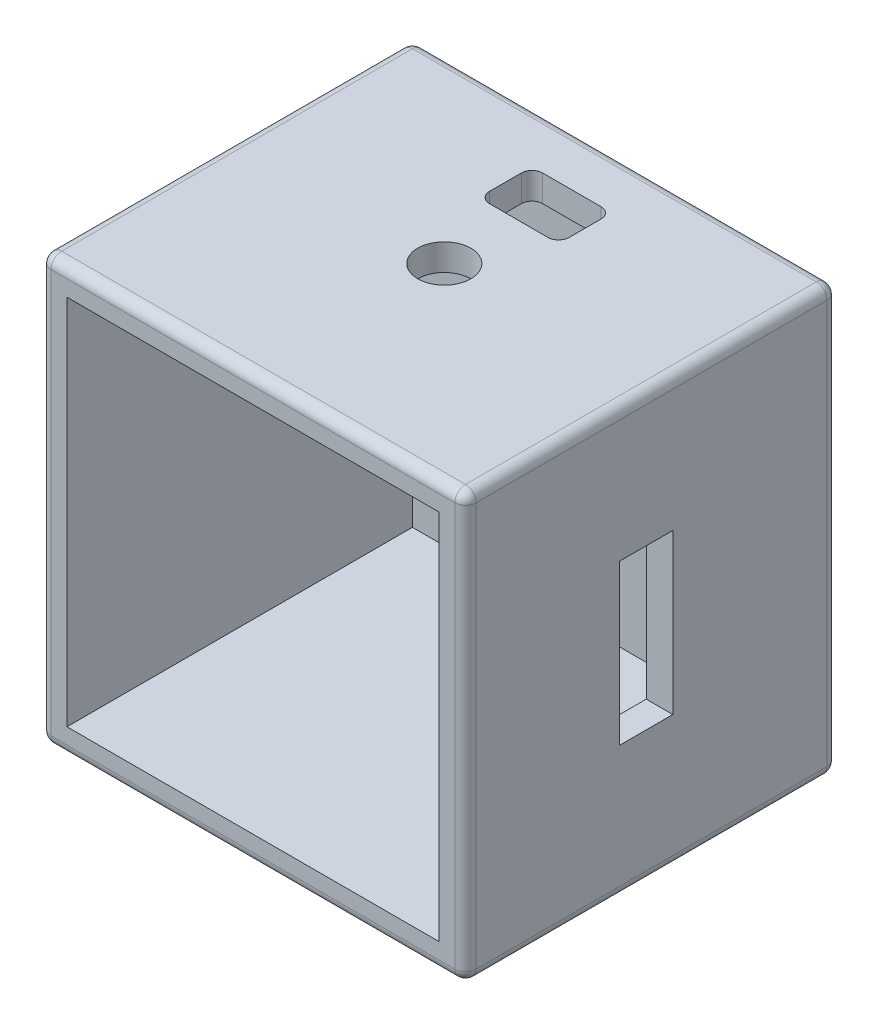
ISO-10303-21;
HEADER;
FILE_DESCRIPTION(('STEP AP214'),'2;1');
FILE_NAME('part.step','',(''),(''),'','','');
FILE_SCHEMA(('AUTOMOTIVE_DESIGN { 1 0 10303 214 1 1 1 1 }'));
ENDSEC;
DATA;
#1=APPLICATION_CONTEXT('core data for automotive mechanical design processes');
#2=APPLICATION_PROTOCOL_DEFINITION('international standard','automotive_design',2000,#1);
#3=PRODUCT_CONTEXT('',#1,'mechanical');
#4=PRODUCT('Part','Part','',(#3));
#5=PRODUCT_RELATED_PRODUCT_CATEGORY('part','',(#4));
#6=PRODUCT_DEFINITION_FORMATION('','',#4);
#7=PRODUCT_DEFINITION_CONTEXT('part definition',#1,'design');
#8=PRODUCT_DEFINITION('design','',#6,#7);
#9=PRODUCT_DEFINITION_SHAPE('','',#8);
#10=(LENGTH_UNIT() NAMED_UNIT(*) SI_UNIT(.MILLI.,.METRE.));
#11=(NAMED_UNIT(*) PLANE_ANGLE_UNIT() SI_UNIT($,.RADIAN.));
#12=(NAMED_UNIT(*) SI_UNIT($,.STERADIAN.) SOLID_ANGLE_UNIT());
#13=UNCERTAINTY_MEASURE_WITH_UNIT(LENGTH_MEASURE(1.E-05),#10,'distance_accuracy_value','');
#14=(GEOMETRIC_REPRESENTATION_CONTEXT(3) GLOBAL_UNCERTAINTY_ASSIGNED_CONTEXT((#13)) GLOBAL_UNIT_ASSIGNED_CONTEXT((#10,
#11,#12)) REPRESENTATION_CONTEXT('',''));
#15=CARTESIAN_POINT('',(0.,0.,0.));
#16=DIRECTION('',(0.,0.,1.));
#17=DIRECTION('',(1.,0.,0.));
#18=AXIS2_PLACEMENT_3D('',#15,#16,#17);
#19=CARTESIAN_POINT('',(-40.,-40.,70.));
#20=DIRECTION('',(1.,0.,0.));
#21=DIRECTION('',(0.,0.,-1.));
#22=AXIS2_PLACEMENT_3D('',#19,#20,#21);
#23=PLANE('',#22);
#24=DIRECTION('',(0.,0.,-1.));
#25=VECTOR('',#24,1.);
#26=CARTESIAN_POINT('',(-40.,-38.,70.));
#27=LINE('',#26,#25);
#28=CARTESIAN_POINT('',(-40.,-38.,2.));
#29=VERTEX_POINT('',#28);
#30=CARTESIAN_POINT('',(-40.,-38.,68.));
#31=VERTEX_POINT('',#30);
#32=EDGE_CURVE('E383',#29,#31,#27,.F.);
#33=ORIENTED_EDGE('',*,*,#32,.T.);
#34=DIRECTION('',(0.,-1.,0.));
#35=VECTOR('',#34,1.);
#36=CARTESIAN_POINT('',(-40.,38.,68.));
#37=LINE('',#36,#35);
#38=CARTESIAN_POINT('',(-40.,38.,68.));
#39=VERTEX_POINT('',#38);
#40=EDGE_CURVE('E552',#31,#39,#37,.F.);
#41=ORIENTED_EDGE('',*,*,#40,.T.);
#42=DIRECTION('',(0.,0.,-1.));
#43=VECTOR('',#42,1.);
#44=CARTESIAN_POINT('',(-40.,38.,70.));
#45=LINE('',#44,#43);
#46=CARTESIAN_POINT('',(-40.,38.,2.));
#47=VERTEX_POINT('',#46);
#48=EDGE_CURVE('E380',#39,#47,#45,.T.);
#49=ORIENTED_EDGE('',*,*,#48,.T.);
#50=DIRECTION('',(0.,-1.,0.));
#51=VECTOR('',#50,1.);
#52=CARTESIAN_POINT('',(-40.,-40.,2.));
#53=LINE('',#52,#51);
#54=EDGE_CURVE('E413',#47,#29,#53,.T.);
#55=ORIENTED_EDGE('',*,*,#54,.T.);
#56=EDGE_LOOP('',(#33,#41,#49,#55));
#57=FACE_BOUND('',#56,.T.);
#58=ADVANCED_FACE('F47',(#57),#23,.F.);
#59=CARTESIAN_POINT('',(40.,-40.,70.));
#60=DIRECTION('',(0.,1.,0.));
#61=DIRECTION('',(-1.,0.,0.));
#62=AXIS2_PLACEMENT_3D('',#59,#60,#61);
#63=PLANE('',#62);
#64=DIRECTION('',(0.,0.,-1.));
#65=VECTOR('',#64,1.);
#66=CARTESIAN_POINT('',(38.,-40.,70.));
#67=LINE('',#66,#65);
#68=CARTESIAN_POINT('',(38.,-40.,2.));
#69=VERTEX_POINT('',#68);
#70=CARTESIAN_POINT('',(38.,-40.,68.));
#71=VERTEX_POINT('',#70);
#72=EDGE_CURVE('E469',#69,#71,#67,.F.);
#73=ORIENTED_EDGE('',*,*,#72,.T.);
#74=DIRECTION('',(1.,0.,0.));
#75=VECTOR('',#74,1.);
#76=CARTESIAN_POINT('',(-38.,-40.,68.));
#77=LINE('',#76,#75);
#78=CARTESIAN_POINT('',(-38.,-40.,68.));
#79=VERTEX_POINT('',#78);
#80=EDGE_CURVE('E57',#71,#79,#77,.F.);
#81=ORIENTED_EDGE('',*,*,#80,.T.);
#82=DIRECTION('',(0.,0.,-1.));
#83=VECTOR('',#82,1.);
#84=CARTESIAN_POINT('',(-38.,-40.,70.));
#85=LINE('',#84,#83);
#86=CARTESIAN_POINT('',(-38.,-40.,2.));
#87=VERTEX_POINT('',#86);
#88=EDGE_CURVE('E368',#79,#87,#85,.T.);
#89=ORIENTED_EDGE('',*,*,#88,.T.);
#90=DIRECTION('',(1.,0.,0.));
#91=VECTOR('',#90,1.);
#92=CARTESIAN_POINT('',(40.,-40.,2.));
#93=LINE('',#92,#91);
#94=EDGE_CURVE('E391',#87,#69,#93,.T.);
#95=ORIENTED_EDGE('',*,*,#94,.T.);
#96=EDGE_LOOP('',(#73,#81,#89,#95));
#97=FACE_BOUND('',#96,.T.);
#98=ADVANCED_FACE('F637',(#97),#63,.F.);
#99=CARTESIAN_POINT('',(40.,-40.,70.));
#100=DIRECTION('',(-1.,0.,0.));
#101=DIRECTION('',(0.,0.,1.));
#102=AXIS2_PLACEMENT_3D('',#99,#100,#101);
#103=PLANE('',#102);
#104=DIRECTION('',(0.,0.,-1.));
#105=VECTOR('',#104,1.);
#106=CARTESIAN_POINT('',(40.,-15.,31.));
#107=LINE('',#106,#105);
#108=CARTESIAN_POINT('',(40.,-15.,41.));
#109=VERTEX_POINT('',#108);
#110=CARTESIAN_POINT('',(40.,-15.,31.));
#111=VERTEX_POINT('',#110);
#112=EDGE_CURVE('E250',#109,#111,#107,.T.);
#113=ORIENTED_EDGE('',*,*,#112,.F.);
#114=DIRECTION('',(0.,-1.,0.));
#115=VECTOR('',#114,1.);
#116=CARTESIAN_POINT('',(40.,-15.,41.));
#117=LINE('',#116,#115);
#118=CARTESIAN_POINT('',(40.,15.,41.));
#119=VERTEX_POINT('',#118);
#120=EDGE_CURVE('E256',#119,#109,#117,.T.);
#121=ORIENTED_EDGE('',*,*,#120,.F.);
#122=DIRECTION('',(0.,0.,1.));
#123=VECTOR('',#122,1.);
#124=CARTESIAN_POINT('',(40.,15.,31.));
#125=LINE('',#124,#123);
#126=CARTESIAN_POINT('',(40.,15.,31.));
#127=VERTEX_POINT('',#126);
#128=EDGE_CURVE('E261',#127,#119,#125,.T.);
#129=ORIENTED_EDGE('',*,*,#128,.F.);
#130=DIRECTION('',(0.,1.,0.));
#131=VECTOR('',#130,1.);
#132=CARTESIAN_POINT('',(40.,-15.,31.));
#133=LINE('',#132,#131);
#134=EDGE_CURVE('E238',#111,#127,#133,.T.);
#135=ORIENTED_EDGE('',*,*,#134,.F.);
#136=EDGE_LOOP('',(#113,#121,#129,#135));
#137=FACE_BOUND('',#136,.T.);
#138=DIRECTION('',(0.,0.,-1.));
#139=VECTOR('',#138,1.);
#140=CARTESIAN_POINT('',(40.,38.,70.));
#141=LINE('',#140,#139);
#142=CARTESIAN_POINT('',(40.,38.,2.));
#143=VERTEX_POINT('',#142);
#144=CARTESIAN_POINT('',(40.,38.,68.));
#145=VERTEX_POINT('',#144);
#146=EDGE_CURVE('E420',#143,#145,#141,.F.);
#147=ORIENTED_EDGE('',*,*,#146,.T.);
#148=DIRECTION('',(0.,1.,0.));
#149=VECTOR('',#148,1.);
#150=CARTESIAN_POINT('',(40.,-38.,68.));
#151=LINE('',#150,#149);
#152=CARTESIAN_POINT('',(40.,-38.,68.));
#153=VERTEX_POINT('',#152);
#154=EDGE_CURVE('E11',#145,#153,#151,.F.);
#155=ORIENTED_EDGE('',*,*,#154,.T.);
#156=DIRECTION('',(0.,0.,-1.));
#157=VECTOR('',#156,1.);
#158=CARTESIAN_POINT('',(40.,-38.,70.));
#159=LINE('',#158,#157);
#160=CARTESIAN_POINT('',(40.,-38.,2.));
#161=VERTEX_POINT('',#160);
#162=EDGE_CURVE('E466',#153,#161,#159,.T.);
#163=ORIENTED_EDGE('',*,*,#162,.T.);
#164=DIRECTION('',(0.,1.,0.));
#165=VECTOR('',#164,1.);
#166=CARTESIAN_POINT('',(40.,-40.,2.));
#167=LINE('',#166,#165);
#168=EDGE_CURVE('E424',#161,#143,#167,.T.);
#169=ORIENTED_EDGE('',*,*,#168,.T.);
#170=EDGE_LOOP('',(#147,#155,#163,#169));
#171=FACE_BOUND('',#170,.T.);
#172=ADVANCED_FACE('F258',(#137,#171),#103,.F.);
#173=CARTESIAN_POINT('',(40.,40.,70.));
#174=DIRECTION('',(0.,-1.,0.));
#175=DIRECTION('',(0.,0.,-1.));
#176=AXIS2_PLACEMENT_3D('',#173,#174,#175);
#177=PLANE('',#176);
#178=CARTESIAN_POINT('',(0.,40.,34.));
#179=DIRECTION('',(0.,1.,0.));
#180=DIRECTION('',(0.,0.,1.));
#181=AXIS2_PLACEMENT_3D('',#178,#179,#180);
#182=CIRCLE('',#181,5.);
#183=CARTESIAN_POINT('',(0.,40.,39.));
#184=VERTEX_POINT('',#183);
#185=EDGE_CURVE('E525',#184,#184,#182,.T.);
#186=ORIENTED_EDGE('',*,*,#185,.F.);
#187=EDGE_LOOP('',(#186));
#188=FACE_BOUND('',#187,.T.);
#189=DIRECTION('',(0.,0.,-1.));
#190=VECTOR('',#189,1.);
#191=CARTESIAN_POINT('',(7.5,40.,18.));
#192=LINE('',#191,#190);
#193=CARTESIAN_POINT('',(7.5,40.,18.));
#194=VERTEX_POINT('',#193);
#195=CARTESIAN_POINT('',(7.5,40.,12.));
#196=VERTEX_POINT('',#195);
#197=EDGE_CURVE('E278',#194,#196,#192,.T.);
#198=ORIENTED_EDGE('',*,*,#197,.F.);
#199=CARTESIAN_POINT('',(5.5,40.,18.));
#200=DIRECTION('',(0.,1.,0.));
#201=DIRECTION('',(0.,0.,-1.));
#202=AXIS2_PLACEMENT_3D('',#199,#200,#201);
#203=CIRCLE('',#202,2.);
#204=CARTESIAN_POINT('',(5.49999999999998,40.,20.));
#205=VERTEX_POINT('',#204);
#206=EDGE_CURVE('E271',#205,#194,#203,.T.);
#207=ORIENTED_EDGE('',*,*,#206,.F.);
#208=DIRECTION('',(1.,0.,0.));
#209=VECTOR('',#208,1.);
#210=CARTESIAN_POINT('',(5.49999999999998,40.,20.));
#211=LINE('',#210,#209);
#212=CARTESIAN_POINT('',(-5.5,40.,20.));
#213=VERTEX_POINT('',#212);
#214=EDGE_CURVE('E302',#213,#205,#211,.T.);
#215=ORIENTED_EDGE('',*,*,#214,.F.);
#216=CARTESIAN_POINT('',(-5.5,40.,18.));
#217=DIRECTION('',(0.,1.,0.));
#218=DIRECTION('',(0.,0.,1.));
#219=AXIS2_PLACEMENT_3D('',#216,#217,#218);
#220=CIRCLE('',#219,2.);
#221=CARTESIAN_POINT('',(-7.5,40.,18.));
#222=VERTEX_POINT('',#221);
#223=EDGE_CURVE('E298',#222,#213,#220,.T.);
#224=ORIENTED_EDGE('',*,*,#223,.F.);
#225=DIRECTION('',(0.,0.,1.));
#226=VECTOR('',#225,1.);
#227=CARTESIAN_POINT('',(-7.5,40.,18.));
#228=LINE('',#227,#226);
#229=CARTESIAN_POINT('',(-7.5,40.,12.));
#230=VERTEX_POINT('',#229);
#231=EDGE_CURVE('E294',#230,#222,#228,.T.);
#232=ORIENTED_EDGE('',*,*,#231,.F.);
#233=CARTESIAN_POINT('',(-5.5,40.,12.));
#234=DIRECTION('',(0.,1.,0.));
#235=DIRECTION('',(0.,0.,1.));
#236=AXIS2_PLACEMENT_3D('',#233,#234,#235);
#237=CIRCLE('',#236,2.);
#238=CARTESIAN_POINT('',(-5.49999999999999,40.,10.));
#239=VERTEX_POINT('',#238);
#240=EDGE_CURVE('E290',#239,#230,#237,.T.);
#241=ORIENTED_EDGE('',*,*,#240,.F.);
#242=DIRECTION('',(-1.,0.,0.));
#243=VECTOR('',#242,1.);
#244=CARTESIAN_POINT('',(5.49999999999998,40.,10.));
#245=LINE('',#244,#243);
#246=CARTESIAN_POINT('',(5.49999999999998,40.,10.));
#247=VERTEX_POINT('',#246);
#248=EDGE_CURVE('E286',#247,#239,#245,.T.);
#249=ORIENTED_EDGE('',*,*,#248,.F.);
#250=CARTESIAN_POINT('',(5.5,40.,12.));
#251=DIRECTION('',(0.,1.,0.));
#252=DIRECTION('',(0.,0.,1.));
#253=AXIS2_PLACEMENT_3D('',#250,#251,#252);
#254=CIRCLE('',#253,2.);
#255=EDGE_CURVE('E282',#196,#247,#254,.T.);
#256=ORIENTED_EDGE('',*,*,#255,.F.);
#257=EDGE_LOOP('',(#198,#207,#215,#224,#232,#241,#249,#256));
#258=FACE_BOUND('',#257,.T.);
#259=DIRECTION('',(0.,0.,-1.));
#260=VECTOR('',#259,1.);
#261=CARTESIAN_POINT('',(-38.,40.,70.));
#262=LINE('',#261,#260);
#263=CARTESIAN_POINT('',(-38.,40.,2.));
#264=VERTEX_POINT('',#263);
#265=CARTESIAN_POINT('',(-38.,40.,68.));
#266=VERTEX_POINT('',#265);
#267=EDGE_CURVE('E387',#264,#266,#262,.F.);
#268=ORIENTED_EDGE('',*,*,#267,.T.);
#269=DIRECTION('',(-1.,0.,0.));
#270=VECTOR('',#269,1.);
#271=CARTESIAN_POINT('',(38.,40.,68.));
#272=LINE('',#271,#270);
#273=CARTESIAN_POINT('',(38.,40.,68.));
#274=VERTEX_POINT('',#273);
#275=EDGE_CURVE('E549',#266,#274,#272,.F.);
#276=ORIENTED_EDGE('',*,*,#275,.T.);
#277=DIRECTION('',(0.,0.,-1.));
#278=VECTOR('',#277,1.);
#279=CARTESIAN_POINT('',(38.,40.,70.));
#280=LINE('',#279,#278);
#281=CARTESIAN_POINT('',(38.,40.,2.));
#282=VERTEX_POINT('',#281);
#283=EDGE_CURVE('E430',#274,#282,#280,.T.);
#284=ORIENTED_EDGE('',*,*,#283,.T.);
#285=DIRECTION('',(-1.,0.,0.));
#286=VECTOR('',#285,1.);
#287=CARTESIAN_POINT('',(40.,40.,2.));
#288=LINE('',#287,#286);
#289=EDGE_CURVE('E427',#282,#264,#288,.T.);
#290=ORIENTED_EDGE('',*,*,#289,.T.);
#291=EDGE_LOOP('',(#268,#276,#284,#290));
#292=FACE_BOUND('',#291,.T.);
#293=ADVANCED_FACE('F734',(#188,#258,#292),#177,.F.);
#294=CARTESIAN_POINT('',(0.,0.,70.));
#295=DIRECTION('',(0.,0.,1.));
#296=DIRECTION('',(1.,0.,0.));
#297=AXIS2_PLACEMENT_3D('',#294,#295,#296);
#298=PLANE('',#297);
#299=DIRECTION('',(0.,1.,0.));
#300=VECTOR('',#299,1.);
#301=CARTESIAN_POINT('',(38.,38.,70.));
#302=LINE('',#301,#300);
#303=CARTESIAN_POINT('',(38.,-38.,70.));
#304=VERTEX_POINT('',#303);
#305=CARTESIAN_POINT('',(38.,38.,70.));
#306=VERTEX_POINT('',#305);
#307=EDGE_CURVE('E538',#304,#306,#302,.T.);
#308=ORIENTED_EDGE('',*,*,#307,.T.);
#309=DIRECTION('',(-1.,0.,0.));
#310=VECTOR('',#309,1.);
#311=CARTESIAN_POINT('',(-38.,38.,70.));
#312=LINE('',#311,#310);
#313=CARTESIAN_POINT('',(-38.,38.,70.));
#314=VERTEX_POINT('',#313);
#315=EDGE_CURVE('E546',#306,#314,#312,.T.);
#316=ORIENTED_EDGE('',*,*,#315,.T.);
#317=DIRECTION('',(0.,-1.,0.));
#318=VECTOR('',#317,1.);
#319=CARTESIAN_POINT('',(-38.,-38.,70.));
#320=LINE('',#319,#318);
#321=CARTESIAN_POINT('',(-38.,-38.,70.));
#322=VERTEX_POINT('',#321);
#323=EDGE_CURVE('E65',#314,#322,#320,.T.);
#324=ORIENTED_EDGE('',*,*,#323,.T.);
#325=DIRECTION('',(1.,0.,0.));
#326=VECTOR('',#325,1.);
#327=CARTESIAN_POINT('',(38.,-38.,70.));
#328=LINE('',#327,#326);
#329=EDGE_CURVE('E541',#322,#304,#328,.T.);
#330=ORIENTED_EDGE('',*,*,#329,.T.);
#331=EDGE_LOOP('',(#308,#316,#324,#330));
#332=FACE_BOUND('',#331,.T.);
#333=DIRECTION('',(0.,-1.,0.));
#334=VECTOR('',#333,1.);
#335=CARTESIAN_POINT('',(-35.,-35.,70.));
#336=LINE('',#335,#334);
#337=CARTESIAN_POINT('',(-35.,35.,70.));
#338=VERTEX_POINT('',#337);
#339=CARTESIAN_POINT('',(-35.,-35.,70.));
#340=VERTEX_POINT('',#339);
#341=EDGE_CURVE('E350',#338,#340,#336,.T.);
#342=ORIENTED_EDGE('',*,*,#341,.F.);
#343=DIRECTION('',(-1.,0.,0.));
#344=VECTOR('',#343,1.);
#345=CARTESIAN_POINT('',(35.,35.,70.));
#346=LINE('',#345,#344);
#347=CARTESIAN_POINT('',(35.,35.,70.));
#348=VERTEX_POINT('',#347);
#349=EDGE_CURVE('E337',#348,#338,#346,.T.);
#350=ORIENTED_EDGE('',*,*,#349,.F.);
#351=DIRECTION('',(0.,1.,0.));
#352=VECTOR('',#351,1.);
#353=CARTESIAN_POINT('',(35.,-35.,70.));
#354=LINE('',#353,#352);
#355=CARTESIAN_POINT('',(35.,-35.,70.));
#356=VERTEX_POINT('',#355);
#357=EDGE_CURVE('E358',#356,#348,#354,.T.);
#358=ORIENTED_EDGE('',*,*,#357,.F.);
#359=DIRECTION('',(1.,0.,0.));
#360=VECTOR('',#359,1.);
#361=CARTESIAN_POINT('',(35.,-35.,70.));
#362=LINE('',#361,#360);
#363=EDGE_CURVE('E353',#340,#356,#362,.T.);
#364=ORIENTED_EDGE('',*,*,#363,.F.);
#365=EDGE_LOOP('',(#342,#350,#358,#364));
#366=FACE_BOUND('',#365,.T.);
#367=ADVANCED_FACE('F612',(#332,#366),#298,.T.);
#368=CARTESIAN_POINT('',(0.,0.,0.));
#369=DIRECTION('',(0.,0.,1.));
#370=DIRECTION('',(1.,0.,0.));
#371=AXIS2_PLACEMENT_3D('',#368,#369,#370);
#372=PLANE('',#371);
#373=DIRECTION('',(0.,1.,0.));
#374=VECTOR('',#373,1.);
#375=CARTESIAN_POINT('',(38.,0.,0.));
#376=LINE('',#375,#374);
#377=CARTESIAN_POINT('',(38.,38.,0.));
#378=VERTEX_POINT('',#377);
#379=CARTESIAN_POINT('',(38.,-38.,0.));
#380=VERTEX_POINT('',#379);
#381=EDGE_CURVE('E398',#378,#380,#376,.F.);
#382=ORIENTED_EDGE('',*,*,#381,.T.);
#383=DIRECTION('',(1.,0.,0.));
#384=VECTOR('',#383,1.);
#385=CARTESIAN_POINT('',(0.,-38.,0.));
#386=LINE('',#385,#384);
#387=CARTESIAN_POINT('',(-38.,-38.,0.));
#388=VERTEX_POINT('',#387);
#389=EDGE_CURVE('E405',#380,#388,#386,.F.);
#390=ORIENTED_EDGE('',*,*,#389,.T.);
#391=DIRECTION('',(0.,-1.,0.));
#392=VECTOR('',#391,1.);
#393=CARTESIAN_POINT('',(-38.,0.,0.));
#394=LINE('',#393,#392);
#395=CARTESIAN_POINT('',(-38.,38.,0.));
#396=VERTEX_POINT('',#395);
#397=EDGE_CURVE('E402',#388,#396,#394,.F.);
#398=ORIENTED_EDGE('',*,*,#397,.T.);
#399=DIRECTION('',(-1.,0.,0.));
#400=VECTOR('',#399,1.);
#401=CARTESIAN_POINT('',(0.,38.,0.));
#402=LINE('',#401,#400);
#403=EDGE_CURVE('E395',#396,#378,#402,.F.);
#404=ORIENTED_EDGE('',*,*,#403,.T.);
#405=EDGE_LOOP('',(#382,#390,#398,#404));
#406=FACE_BOUND('',#405,.T.);
#407=ADVANCED_FACE('F623',(#406),#372,.F.);
#408=CARTESIAN_POINT('',(-35.,-35.,5.));
#409=DIRECTION('',(-1.,0.,0.));
#410=DIRECTION('',(0.,0.,1.));
#411=AXIS2_PLACEMENT_3D('',#408,#409,#410);
#412=PLANE('',#411);
#413=ORIENTED_EDGE('',*,*,#341,.T.);
#414=DIRECTION('',(0.,0.,1.));
#415=VECTOR('',#414,1.);
#416=CARTESIAN_POINT('',(-35.,-35.,5.));
#417=LINE('',#416,#415);
#418=CARTESIAN_POINT('',(-35.,-35.,5.));
#419=VERTEX_POINT('',#418);
#420=EDGE_CURVE('E349',#419,#340,#417,.T.);
#421=ORIENTED_EDGE('',*,*,#420,.F.);
#422=DIRECTION('',(0.,-1.,0.));
#423=VECTOR('',#422,1.);
#424=CARTESIAN_POINT('',(-35.,-35.,5.));
#425=LINE('',#424,#423);
#426=CARTESIAN_POINT('',(-35.,35.,5.));
#427=VERTEX_POINT('',#426);
#428=EDGE_CURVE('E332',#427,#419,#425,.T.);
#429=ORIENTED_EDGE('',*,*,#428,.F.);
#430=DIRECTION('',(0.,0.,1.));
#431=VECTOR('',#430,1.);
#432=CARTESIAN_POINT('',(-35.,35.,5.));
#433=LINE('',#432,#431);
#434=EDGE_CURVE('E365',#427,#338,#433,.T.);
#435=ORIENTED_EDGE('',*,*,#434,.T.);
#436=EDGE_LOOP('',(#413,#421,#429,#435));
#437=FACE_BOUND('',#436,.T.);
#438=ADVANCED_FACE('F621',(#437),#412,.F.);
#439=CARTESIAN_POINT('',(35.,35.,5.));
#440=DIRECTION('',(0.,1.,0.));
#441=DIRECTION('',(0.,0.,1.));
#442=AXIS2_PLACEMENT_3D('',#439,#440,#441);
#443=PLANE('',#442);
#444=CARTESIAN_POINT('',(0.,35.,34.));
#445=DIRECTION('',(0.,1.,0.));
#446=DIRECTION('',(0.,0.,1.));
#447=AXIS2_PLACEMENT_3D('',#444,#445,#446);
#448=CIRCLE('',#447,5.);
#449=CARTESIAN_POINT('',(0.,35.,39.));
#450=VERTEX_POINT('',#449);
#451=EDGE_CURVE('E521',#450,#450,#448,.T.);
#452=ORIENTED_EDGE('',*,*,#451,.T.);
#453=EDGE_LOOP('',(#452));
#454=FACE_BOUND('',#453,.T.);
#455=DIRECTION('',(1.,0.,0.));
#456=VECTOR('',#455,1.);
#457=CARTESIAN_POINT('',(35.,35.,20.));
#458=LINE('',#457,#456);
#459=CARTESIAN_POINT('',(-5.5,35.,20.));
#460=VERTEX_POINT('',#459);
#461=CARTESIAN_POINT('',(5.49999999999998,35.,20.));
#462=VERTEX_POINT('',#461);
#463=EDGE_CURVE('E499',#460,#462,#458,.T.);
#464=ORIENTED_EDGE('',*,*,#463,.T.);
#465=CARTESIAN_POINT('',(5.5,35.,18.));
#466=DIRECTION('',(0.,1.,0.));
#467=DIRECTION('',(0.,0.,1.));
#468=AXIS2_PLACEMENT_3D('',#465,#466,#467);
#469=CIRCLE('',#468,2.);
#470=CARTESIAN_POINT('',(7.5,35.,18.));
#471=VERTEX_POINT('',#470);
#472=EDGE_CURVE('E503',#462,#471,#469,.T.);
#473=ORIENTED_EDGE('',*,*,#472,.T.);
#474=DIRECTION('',(0.,0.,-1.));
#475=VECTOR('',#474,1.);
#476=CARTESIAN_POINT('',(7.5,35.,5.));
#477=LINE('',#476,#475);
#478=CARTESIAN_POINT('',(7.5,35.,12.));
#479=VERTEX_POINT('',#478);
#480=EDGE_CURVE('E473',#471,#479,#477,.T.);
#481=ORIENTED_EDGE('',*,*,#480,.T.);
#482=CARTESIAN_POINT('',(5.5,35.,12.));
#483=DIRECTION('',(0.,1.,0.));
#484=DIRECTION('',(0.,0.,1.));
#485=AXIS2_PLACEMENT_3D('',#482,#483,#484);
#486=CIRCLE('',#485,2.);
#487=CARTESIAN_POINT('',(5.49999999999998,35.,10.));
#488=VERTEX_POINT('',#487);
#489=EDGE_CURVE('E479',#479,#488,#486,.T.);
#490=ORIENTED_EDGE('',*,*,#489,.T.);
#491=DIRECTION('',(-1.,0.,0.));
#492=VECTOR('',#491,1.);
#493=CARTESIAN_POINT('',(35.,35.,10.));
#494=LINE('',#493,#492);
#495=CARTESIAN_POINT('',(-5.49999999999999,35.,10.));
#496=VERTEX_POINT('',#495);
#497=EDGE_CURVE('E483',#488,#496,#494,.T.);
#498=ORIENTED_EDGE('',*,*,#497,.T.);
#499=CARTESIAN_POINT('',(-5.5,35.,12.));
#500=DIRECTION('',(0.,1.,0.));
#501=DIRECTION('',(0.,0.,1.));
#502=AXIS2_PLACEMENT_3D('',#499,#500,#501);
#503=CIRCLE('',#502,2.);
#504=CARTESIAN_POINT('',(-7.5,35.,12.));
#505=VERTEX_POINT('',#504);
#506=EDGE_CURVE('E487',#496,#505,#503,.T.);
#507=ORIENTED_EDGE('',*,*,#506,.T.);
#508=DIRECTION('',(0.,0.,1.));
#509=VECTOR('',#508,1.);
#510=CARTESIAN_POINT('',(-7.5,35.,5.));
#511=LINE('',#510,#509);
#512=CARTESIAN_POINT('',(-7.5,35.,18.));
#513=VERTEX_POINT('',#512);
#514=EDGE_CURVE('E491',#505,#513,#511,.T.);
#515=ORIENTED_EDGE('',*,*,#514,.T.);
#516=CARTESIAN_POINT('',(-5.5,35.,18.));
#517=DIRECTION('',(0.,1.,0.));
#518=DIRECTION('',(0.,0.,1.));
#519=AXIS2_PLACEMENT_3D('',#516,#517,#518);
#520=CIRCLE('',#519,2.);
#521=EDGE_CURVE('E495',#513,#460,#520,.T.);
#522=ORIENTED_EDGE('',*,*,#521,.T.);
#523=EDGE_LOOP('',(#464,#473,#481,#490,#498,#507,#515,#522));
#524=FACE_BOUND('',#523,.T.);
#525=ORIENTED_EDGE('',*,*,#349,.T.);
#526=ORIENTED_EDGE('',*,*,#434,.F.);
#527=DIRECTION('',(-1.,0.,0.));
#528=VECTOR('',#527,1.);
#529=CARTESIAN_POINT('',(35.,35.,5.));
#530=LINE('',#529,#528);
#531=CARTESIAN_POINT('',(35.,35.,5.));
#532=VERTEX_POINT('',#531);
#533=EDGE_CURVE('E345',#532,#427,#530,.T.);
#534=ORIENTED_EDGE('',*,*,#533,.F.);
#535=DIRECTION('',(0.,0.,1.));
#536=VECTOR('',#535,1.);
#537=CARTESIAN_POINT('',(35.,35.,5.));
#538=LINE('',#537,#536);
#539=EDGE_CURVE('E369',#532,#348,#538,.T.);
#540=ORIENTED_EDGE('',*,*,#539,.T.);
#541=EDGE_LOOP('',(#525,#526,#534,#540));
#542=FACE_BOUND('',#541,.T.);
#543=ADVANCED_FACE('F604',(#454,#524,#542),#443,.F.);
#544=CARTESIAN_POINT('',(35.,-35.,5.));
#545=DIRECTION('',(1.,0.,0.));
#546=DIRECTION('',(0.,0.,-1.));
#547=AXIS2_PLACEMENT_3D('',#544,#545,#546);
#548=PLANE('',#547);
#549=DIRECTION('',(0.,0.,1.));
#550=VECTOR('',#549,1.);
#551=CARTESIAN_POINT('',(35.,15.,5.));
#552=LINE('',#551,#550);
#553=CARTESIAN_POINT('',(35.,15.,31.));
#554=VERTEX_POINT('',#553);
#555=CARTESIAN_POINT('',(35.,15.,41.));
#556=VERTEX_POINT('',#555);
#557=EDGE_CURVE('E512',#554,#556,#552,.T.);
#558=ORIENTED_EDGE('',*,*,#557,.T.);
#559=DIRECTION('',(0.,-1.,0.));
#560=VECTOR('',#559,1.);
#561=CARTESIAN_POINT('',(35.,-35.,41.));
#562=LINE('',#561,#560);
#563=CARTESIAN_POINT('',(35.,-15.,41.));
#564=VERTEX_POINT('',#563);
#565=EDGE_CURVE('E516',#556,#564,#562,.T.);
#566=ORIENTED_EDGE('',*,*,#565,.T.);
#567=DIRECTION('',(0.,0.,-1.));
#568=VECTOR('',#567,1.);
#569=CARTESIAN_POINT('',(35.,-15.,5.00000000000001));
#570=LINE('',#569,#568);
#571=CARTESIAN_POINT('',(35.,-15.,31.));
#572=VERTEX_POINT('',#571);
#573=EDGE_CURVE('E507',#564,#572,#570,.T.);
#574=ORIENTED_EDGE('',*,*,#573,.T.);
#575=DIRECTION('',(0.,1.,0.));
#576=VECTOR('',#575,1.);
#577=CARTESIAN_POINT('',(35.,-35.,31.));
#578=LINE('',#577,#576);
#579=EDGE_CURVE('E241',#572,#554,#578,.T.);
#580=ORIENTED_EDGE('',*,*,#579,.T.);
#581=EDGE_LOOP('',(#558,#566,#574,#580));
#582=FACE_BOUND('',#581,.T.);
#583=ORIENTED_EDGE('',*,*,#357,.T.);
#584=ORIENTED_EDGE('',*,*,#539,.F.);
#585=DIRECTION('',(0.,1.,0.));
#586=VECTOR('',#585,1.);
#587=CARTESIAN_POINT('',(35.,-35.,5.));
#588=LINE('',#587,#586);
#589=CARTESIAN_POINT('',(35.,-35.,5.));
#590=VERTEX_POINT('',#589);
#591=EDGE_CURVE('E341',#590,#532,#588,.T.);
#592=ORIENTED_EDGE('',*,*,#591,.F.);
#593=DIRECTION('',(0.,0.,1.));
#594=VECTOR('',#593,1.);
#595=CARTESIAN_POINT('',(35.,-35.,5.));
#596=LINE('',#595,#594);
#597=EDGE_CURVE('E372',#590,#356,#596,.T.);
#598=ORIENTED_EDGE('',*,*,#597,.T.);
#599=EDGE_LOOP('',(#583,#584,#592,#598));
#600=FACE_BOUND('',#599,.T.);
#601=ADVANCED_FACE('F600',(#582,#600),#548,.F.);
#602=CARTESIAN_POINT('',(35.,-35.,5.));
#603=DIRECTION('',(0.,-1.,0.));
#604=DIRECTION('',(0.,0.,-1.));
#605=AXIS2_PLACEMENT_3D('',#602,#603,#604);
#606=PLANE('',#605);
#607=ORIENTED_EDGE('',*,*,#363,.T.);
#608=ORIENTED_EDGE('',*,*,#597,.F.);
#609=DIRECTION('',(1.,0.,0.));
#610=VECTOR('',#609,1.);
#611=CARTESIAN_POINT('',(35.,-35.,5.));
#612=LINE('',#611,#610);
#613=EDGE_CURVE('E336',#419,#590,#612,.T.);
#614=ORIENTED_EDGE('',*,*,#613,.F.);
#615=ORIENTED_EDGE('',*,*,#420,.T.);
#616=EDGE_LOOP('',(#607,#608,#614,#615));
#617=FACE_BOUND('',#616,.T.);
#618=ADVANCED_FACE('F603',(#617),#606,.F.);
#619=CARTESIAN_POINT('',(0.,0.,5.));
#620=DIRECTION('',(0.,0.,1.));
#621=DIRECTION('',(1.,0.,0.));
#622=AXIS2_PLACEMENT_3D('',#619,#620,#621);
#623=PLANE('',#622);
#624=ORIENTED_EDGE('',*,*,#428,.T.);
#625=ORIENTED_EDGE('',*,*,#613,.T.);
#626=ORIENTED_EDGE('',*,*,#591,.T.);
#627=ORIENTED_EDGE('',*,*,#533,.T.);
#628=EDGE_LOOP('',(#624,#625,#626,#627));
#629=FACE_BOUND('',#628,.T.);
#630=ADVANCED_FACE('F617',(#629),#623,.T.);
#631=CARTESIAN_POINT('',(-38.,-38.,70.));
#632=DIRECTION('',(0.,0.,-1.));
#633=DIRECTION('',(-1.,0.,0.));
#634=AXIS2_PLACEMENT_3D('',#631,#632,#633);
#635=CYLINDRICAL_SURFACE('',#634,2.);
#636=ORIENTED_EDGE('',*,*,#88,.F.);
#637=CARTESIAN_POINT('',(-38.,-38.,68.));
#638=DIRECTION('',(0.,0.,-1.));
#639=DIRECTION('',(-1.,0.,0.));
#640=AXIS2_PLACEMENT_3D('',#637,#638,#639);
#641=CIRCLE('',#640,2.);
#642=EDGE_CURVE('E529',#79,#31,#641,.T.);
#643=ORIENTED_EDGE('',*,*,#642,.T.);
#644=ORIENTED_EDGE('',*,*,#32,.F.);
#645=CARTESIAN_POINT('',(-38.,-38.,2.));
#646=DIRECTION('',(0.,0.,-1.));
#647=DIRECTION('',(-1.,0.,0.));
#648=AXIS2_PLACEMENT_3D('',#645,#646,#647);
#649=CIRCLE('',#648,2.);
#650=EDGE_CURVE('E409',#29,#87,#649,.F.);
#651=ORIENTED_EDGE('',*,*,#650,.T.);
#652=EDGE_LOOP('',(#636,#643,#644,#651));
#653=FACE_BOUND('',#652,.T.);
#654=ADVANCED_FACE('F648',(#653),#635,.T.);
#655=CARTESIAN_POINT('',(-38.,38.,70.));
#656=DIRECTION('',(0.,0.,-1.));
#657=DIRECTION('',(-1.,0.,0.));
#658=AXIS2_PLACEMENT_3D('',#655,#656,#657);
#659=CYLINDRICAL_SURFACE('',#658,2.);
#660=ORIENTED_EDGE('',*,*,#48,.F.);
#661=CARTESIAN_POINT('',(-38.,38.,68.));
#662=DIRECTION('',(0.,0.,-1.));
#663=DIRECTION('',(-1.,0.,0.));
#664=AXIS2_PLACEMENT_3D('',#661,#662,#663);
#665=CIRCLE('',#664,2.);
#666=EDGE_CURVE('E532',#39,#266,#665,.T.);
#667=ORIENTED_EDGE('',*,*,#666,.T.);
#668=ORIENTED_EDGE('',*,*,#267,.F.);
#669=CARTESIAN_POINT('',(-38.,38.,2.));
#670=DIRECTION('',(0.,0.,-1.));
#671=DIRECTION('',(-1.,0.,0.));
#672=AXIS2_PLACEMENT_3D('',#669,#670,#671);
#673=CIRCLE('',#672,2.);
#674=EDGE_CURVE('E416',#264,#47,#673,.F.);
#675=ORIENTED_EDGE('',*,*,#674,.T.);
#676=EDGE_LOOP('',(#660,#667,#668,#675));
#677=FACE_BOUND('',#676,.T.);
#678=ADVANCED_FACE('F651',(#677),#659,.T.);
#679=CARTESIAN_POINT('',(-38.,38.,2.));
#680=DIRECTION('',(0.,0.,1.));
#681=DIRECTION('',(1.,0.,0.));
#682=AXIS2_PLACEMENT_3D('',#679,#680,#681);
#683=SPHERICAL_SURFACE('',#682,2.);
#684=CARTESIAN_POINT('',(-38.,38.,2.));
#685=DIRECTION('',(0.,-1.,0.));
#686=DIRECTION('',(0.,0.,-1.));
#687=AXIS2_PLACEMENT_3D('',#684,#685,#686);
#688=CIRCLE('',#687,2.);
#689=EDGE_CURVE('E453',#47,#396,#688,.T.);
#690=ORIENTED_EDGE('',*,*,#689,.F.);
#691=ORIENTED_EDGE('',*,*,#674,.F.);
#692=CARTESIAN_POINT('',(-38.,38.,2.));
#693=DIRECTION('',(1.,0.,0.));
#694=DIRECTION('',(0.,0.,-1.));
#695=AXIS2_PLACEMENT_3D('',#692,#693,#694);
#696=CIRCLE('',#695,2.);
#697=EDGE_CURVE('E354',#396,#264,#696,.T.);
#698=ORIENTED_EDGE('',*,*,#697,.F.);
#699=EDGE_LOOP('',(#690,#691,#698));
#700=FACE_BOUND('',#699,.T.);
#701=ADVANCED_FACE('F655',(#700),#683,.T.);
#702=CARTESIAN_POINT('',(38.,38.,70.));
#703=DIRECTION('',(0.,0.,-1.));
#704=DIRECTION('',(-1.,0.,0.));
#705=AXIS2_PLACEMENT_3D('',#702,#703,#704);
#706=CYLINDRICAL_SURFACE('',#705,2.);
#707=ORIENTED_EDGE('',*,*,#283,.F.);
#708=CARTESIAN_POINT('',(38.,38.,68.));
#709=DIRECTION('',(0.,0.,-1.));
#710=DIRECTION('',(-1.,0.,0.));
#711=AXIS2_PLACEMENT_3D('',#708,#709,#710);
#712=CIRCLE('',#711,2.);
#713=EDGE_CURVE('E535',#274,#145,#712,.T.);
#714=ORIENTED_EDGE('',*,*,#713,.T.);
#715=ORIENTED_EDGE('',*,*,#146,.F.);
#716=CARTESIAN_POINT('',(38.,38.,2.));
#717=DIRECTION('',(0.,0.,-1.));
#718=DIRECTION('',(-1.,0.,0.));
#719=AXIS2_PLACEMENT_3D('',#716,#717,#718);
#720=CIRCLE('',#719,2.);
#721=EDGE_CURVE('E449',#282,#143,#720,.T.);
#722=ORIENTED_EDGE('',*,*,#721,.F.);
#723=EDGE_LOOP('',(#707,#714,#715,#722));
#724=FACE_BOUND('',#723,.T.);
#725=ADVANCED_FACE('F681',(#724),#706,.T.);
#726=CARTESIAN_POINT('',(40.,38.,2.));
#727=DIRECTION('',(-1.,0.,0.));
#728=DIRECTION('',(0.,0.,1.));
#729=AXIS2_PLACEMENT_3D('',#726,#727,#728);
#730=CYLINDRICAL_SURFACE('',#729,2.);
#731=ORIENTED_EDGE('',*,*,#697,.T.);
#732=ORIENTED_EDGE('',*,*,#289,.F.);
#733=CARTESIAN_POINT('',(38.,38.,2.));
#734=DIRECTION('',(1.,0.,0.));
#735=DIRECTION('',(0.,0.,-1.));
#736=AXIS2_PLACEMENT_3D('',#733,#734,#735);
#737=CIRCLE('',#736,2.);
#738=EDGE_CURVE('E445',#378,#282,#737,.T.);
#739=ORIENTED_EDGE('',*,*,#738,.F.);
#740=ORIENTED_EDGE('',*,*,#403,.F.);
#741=EDGE_LOOP('',(#731,#732,#739,#740));
#742=FACE_BOUND('',#741,.T.);
#743=ADVANCED_FACE('F677',(#742),#730,.T.);
#744=CARTESIAN_POINT('',(-38.,-40.,2.));
#745=DIRECTION('',(0.,-1.,0.));
#746=DIRECTION('',(0.,0.,-1.));
#747=AXIS2_PLACEMENT_3D('',#744,#745,#746);
#748=CYLINDRICAL_SURFACE('',#747,2.);
#749=ORIENTED_EDGE('',*,*,#689,.T.);
#750=ORIENTED_EDGE('',*,*,#397,.F.);
#751=CARTESIAN_POINT('',(-38.,-38.,2.));
#752=DIRECTION('',(0.,-1.,0.));
#753=DIRECTION('',(0.,0.,-1.));
#754=AXIS2_PLACEMENT_3D('',#751,#752,#753);
#755=CIRCLE('',#754,2.);
#756=EDGE_CURVE('E441',#29,#388,#755,.T.);
#757=ORIENTED_EDGE('',*,*,#756,.F.);
#758=ORIENTED_EDGE('',*,*,#54,.F.);
#759=EDGE_LOOP('',(#749,#750,#757,#758));
#760=FACE_BOUND('',#759,.T.);
#761=ADVANCED_FACE('F673',(#760),#748,.T.);
#762=CARTESIAN_POINT('',(38.,38.,2.));
#763=DIRECTION('',(0.,1.,0.));
#764=DIRECTION('',(0.,0.,1.));
#765=AXIS2_PLACEMENT_3D('',#762,#763,#764);
#766=SPHERICAL_SURFACE('',#765,2.);
#767=ORIENTED_EDGE('',*,*,#738,.T.);
#768=ORIENTED_EDGE('',*,*,#721,.T.);
#769=CARTESIAN_POINT('',(38.,38.,2.));
#770=DIRECTION('',(0.,1.,0.));
#771=DIRECTION('',(0.,0.,1.));
#772=AXIS2_PLACEMENT_3D('',#769,#770,#771);
#773=CIRCLE('',#772,2.);
#774=EDGE_CURVE('E437',#378,#143,#773,.F.);
#775=ORIENTED_EDGE('',*,*,#774,.F.);
#776=EDGE_LOOP('',(#767,#768,#775));
#777=FACE_BOUND('',#776,.T.);
#778=ADVANCED_FACE('F669',(#777),#766,.T.);
#779=CARTESIAN_POINT('',(-38.,-38.,2.));
#780=DIRECTION('',(0.,0.,1.));
#781=DIRECTION('',(1.,0.,0.));
#782=AXIS2_PLACEMENT_3D('',#779,#780,#781);
#783=SPHERICAL_SURFACE('',#782,2.);
#784=ORIENTED_EDGE('',*,*,#650,.F.);
#785=ORIENTED_EDGE('',*,*,#756,.T.);
#786=CARTESIAN_POINT('',(-38.,-38.,2.));
#787=DIRECTION('',(1.,0.,0.));
#788=DIRECTION('',(0.,0.,-1.));
#789=AXIS2_PLACEMENT_3D('',#786,#787,#788);
#790=CIRCLE('',#789,2.);
#791=EDGE_CURVE('E434',#87,#388,#790,.T.);
#792=ORIENTED_EDGE('',*,*,#791,.F.);
#793=EDGE_LOOP('',(#784,#785,#792));
#794=FACE_BOUND('',#793,.T.);
#795=ADVANCED_FACE('F665',(#794),#783,.T.);
#796=CARTESIAN_POINT('',(38.,-40.,2.));
#797=DIRECTION('',(0.,1.,0.));
#798=DIRECTION('',(0.,0.,1.));
#799=AXIS2_PLACEMENT_3D('',#796,#797,#798);
#800=CYLINDRICAL_SURFACE('',#799,2.);
#801=ORIENTED_EDGE('',*,*,#168,.F.);
#802=CARTESIAN_POINT('',(38.,-38.,2.));
#803=DIRECTION('',(0.,1.,0.));
#804=DIRECTION('',(0.,0.,1.));
#805=AXIS2_PLACEMENT_3D('',#802,#803,#804);
#806=CIRCLE('',#805,2.);
#807=EDGE_CURVE('E463',#161,#380,#806,.T.);
#808=ORIENTED_EDGE('',*,*,#807,.T.);
#809=ORIENTED_EDGE('',*,*,#381,.F.);
#810=ORIENTED_EDGE('',*,*,#774,.T.);
#811=EDGE_LOOP('',(#801,#808,#809,#810));
#812=FACE_BOUND('',#811,.T.);
#813=ADVANCED_FACE('F661',(#812),#800,.T.);
#814=CARTESIAN_POINT('',(40.,-38.,2.));
#815=DIRECTION('',(1.,0.,0.));
#816=DIRECTION('',(0.,1.,0.));
#817=AXIS2_PLACEMENT_3D('',#814,#815,#816);
#818=CYLINDRICAL_SURFACE('',#817,2.);
#819=ORIENTED_EDGE('',*,*,#389,.F.);
#820=CARTESIAN_POINT('',(38.,-38.,2.));
#821=DIRECTION('',(1.,0.,0.));
#822=DIRECTION('',(0.,1.,0.));
#823=AXIS2_PLACEMENT_3D('',#820,#821,#822);
#824=CIRCLE('',#823,2.);
#825=EDGE_CURVE('E433',#380,#69,#824,.F.);
#826=ORIENTED_EDGE('',*,*,#825,.T.);
#827=ORIENTED_EDGE('',*,*,#94,.F.);
#828=ORIENTED_EDGE('',*,*,#791,.T.);
#829=EDGE_LOOP('',(#819,#826,#827,#828));
#830=FACE_BOUND('',#829,.T.);
#831=ADVANCED_FACE('F657',(#830),#818,.T.);
#832=CARTESIAN_POINT('',(38.,-38.,70.));
#833=DIRECTION('',(0.,0.,-1.));
#834=DIRECTION('',(-1.,0.,0.));
#835=AXIS2_PLACEMENT_3D('',#832,#833,#834);
#836=CYLINDRICAL_SURFACE('',#835,2.);
#837=ORIENTED_EDGE('',*,*,#162,.F.);
#838=CARTESIAN_POINT('',(38.,-38.,68.));
#839=DIRECTION('',(0.,0.,-1.));
#840=DIRECTION('',(-1.,0.,0.));
#841=AXIS2_PLACEMENT_3D('',#838,#839,#840);
#842=CIRCLE('',#841,2.);
#843=EDGE_CURVE('E520',#153,#71,#842,.T.);
#844=ORIENTED_EDGE('',*,*,#843,.T.);
#845=ORIENTED_EDGE('',*,*,#72,.F.);
#846=CARTESIAN_POINT('',(38.,-38.,2.));
#847=DIRECTION('',(0.,0.,-1.));
#848=DIRECTION('',(-1.,0.,0.));
#849=AXIS2_PLACEMENT_3D('',#846,#847,#848);
#850=CIRCLE('',#849,2.);
#851=EDGE_CURVE('E310',#161,#69,#850,.T.);
#852=ORIENTED_EDGE('',*,*,#851,.F.);
#853=EDGE_LOOP('',(#837,#844,#845,#852));
#854=FACE_BOUND('',#853,.T.);
#855=ADVANCED_FACE('F660',(#854),#836,.T.);
#856=CARTESIAN_POINT('',(38.,-38.,2.));
#857=DIRECTION('',(0.,0.,1.));
#858=DIRECTION('',(1.,0.,0.));
#859=AXIS2_PLACEMENT_3D('',#856,#857,#858);
#860=SPHERICAL_SURFACE('',#859,2.);
#861=ORIENTED_EDGE('',*,*,#825,.F.);
#862=ORIENTED_EDGE('',*,*,#807,.F.);
#863=ORIENTED_EDGE('',*,*,#851,.T.);
#864=EDGE_LOOP('',(#861,#862,#863));
#865=FACE_BOUND('',#864,.T.);
#866=ADVANCED_FACE('F689',(#865),#860,.T.);
#867=CARTESIAN_POINT('',(5.5,30.,18.));
#868=DIRECTION('',(0.,1.,0.));
#869=DIRECTION('',(0.,0.,1.));
#870=AXIS2_PLACEMENT_3D('',#867,#868,#869);
#871=CYLINDRICAL_SURFACE('',#870,2.);
#872=DIRECTION('',(0.,1.,0.));
#873=VECTOR('',#872,1.);
#874=CARTESIAN_POINT('',(5.49999999999998,30.,20.));
#875=LINE('',#874,#873);
#876=EDGE_CURVE('E307',#462,#205,#875,.T.);
#877=ORIENTED_EDGE('',*,*,#876,.T.);
#878=ORIENTED_EDGE('',*,*,#206,.T.);
#879=DIRECTION('',(0.,1.,0.));
#880=VECTOR('',#879,1.);
#881=CARTESIAN_POINT('',(7.5,30.,18.));
#882=LINE('',#881,#880);
#883=EDGE_CURVE('E306',#471,#194,#882,.T.);
#884=ORIENTED_EDGE('',*,*,#883,.F.);
#885=ORIENTED_EDGE('',*,*,#472,.F.);
#886=EDGE_LOOP('',(#877,#878,#884,#885));
#887=FACE_BOUND('',#886,.T.);
#888=ADVANCED_FACE('F692',(#887),#871,.F.);
#889=CARTESIAN_POINT('',(5.49999999999998,30.,20.));
#890=DIRECTION('',(0.,0.,1.));
#891=DIRECTION('',(1.,0.,0.));
#892=AXIS2_PLACEMENT_3D('',#889,#890,#891);
#893=PLANE('',#892);
#894=DIRECTION('',(0.,1.,0.));
#895=VECTOR('',#894,1.);
#896=CARTESIAN_POINT('',(-5.5,30.,20.));
#897=LINE('',#896,#895);
#898=EDGE_CURVE('E311',#460,#213,#897,.T.);
#899=ORIENTED_EDGE('',*,*,#898,.T.);
#900=ORIENTED_EDGE('',*,*,#214,.T.);
#901=ORIENTED_EDGE('',*,*,#876,.F.);
#902=ORIENTED_EDGE('',*,*,#463,.F.);
#903=EDGE_LOOP('',(#899,#900,#901,#902));
#904=FACE_BOUND('',#903,.T.);
#905=ADVANCED_FACE('F829',(#904),#893,.F.);
#906=CARTESIAN_POINT('',(-5.5,30.,18.));
#907=DIRECTION('',(0.,1.,0.));
#908=DIRECTION('',(0.,0.,1.));
#909=AXIS2_PLACEMENT_3D('',#906,#907,#908);
#910=CYLINDRICAL_SURFACE('',#909,2.);
#911=DIRECTION('',(0.,1.,0.));
#912=VECTOR('',#911,1.);
#913=CARTESIAN_POINT('',(-7.5,30.,18.));
#914=LINE('',#913,#912);
#915=EDGE_CURVE('E314',#513,#222,#914,.T.);
#916=ORIENTED_EDGE('',*,*,#915,.T.);
#917=ORIENTED_EDGE('',*,*,#223,.T.);
#918=ORIENTED_EDGE('',*,*,#898,.F.);
#919=ORIENTED_EDGE('',*,*,#521,.F.);
#920=EDGE_LOOP('',(#916,#917,#918,#919));
#921=FACE_BOUND('',#920,.T.);
#922=ADVANCED_FACE('F839',(#921),#910,.F.);
#923=CARTESIAN_POINT('',(-7.5,30.,18.));
#924=DIRECTION('',(-1.,0.,0.));
#925=DIRECTION('',(0.,0.,1.));
#926=AXIS2_PLACEMENT_3D('',#923,#924,#925);
#927=PLANE('',#926);
#928=DIRECTION('',(0.,1.,0.));
#929=VECTOR('',#928,1.);
#930=CARTESIAN_POINT('',(-7.5,30.,12.));
#931=LINE('',#930,#929);
#932=EDGE_CURVE('E317',#505,#230,#931,.T.);
#933=ORIENTED_EDGE('',*,*,#932,.T.);
#934=ORIENTED_EDGE('',*,*,#231,.T.);
#935=ORIENTED_EDGE('',*,*,#915,.F.);
#936=ORIENTED_EDGE('',*,*,#514,.F.);
#937=EDGE_LOOP('',(#933,#934,#935,#936));
#938=FACE_BOUND('',#937,.T.);
#939=ADVANCED_FACE('F849',(#938),#927,.F.);
#940=CARTESIAN_POINT('',(-5.5,30.,12.));
#941=DIRECTION('',(0.,1.,0.));
#942=DIRECTION('',(0.,0.,1.));
#943=AXIS2_PLACEMENT_3D('',#940,#941,#942);
#944=CYLINDRICAL_SURFACE('',#943,2.);
#945=DIRECTION('',(0.,1.,0.));
#946=VECTOR('',#945,1.);
#947=CARTESIAN_POINT('',(-5.49999999999999,30.,10.));
#948=LINE('',#947,#946);
#949=EDGE_CURVE('E320',#496,#239,#948,.T.);
#950=ORIENTED_EDGE('',*,*,#949,.T.);
#951=ORIENTED_EDGE('',*,*,#240,.T.);
#952=ORIENTED_EDGE('',*,*,#932,.F.);
#953=ORIENTED_EDGE('',*,*,#506,.F.);
#954=EDGE_LOOP('',(#950,#951,#952,#953));
#955=FACE_BOUND('',#954,.T.);
#956=ADVANCED_FACE('F859',(#955),#944,.F.);
#957=CARTESIAN_POINT('',(5.49999999999998,30.,10.));
#958=DIRECTION('',(0.,0.,-1.));
#959=DIRECTION('',(-1.,0.,0.));
#960=AXIS2_PLACEMENT_3D('',#957,#958,#959);
#961=PLANE('',#960);
#962=DIRECTION('',(0.,1.,0.));
#963=VECTOR('',#962,1.);
#964=CARTESIAN_POINT('',(5.49999999999998,30.,10.));
#965=LINE('',#964,#963);
#966=EDGE_CURVE('E323',#488,#247,#965,.T.);
#967=ORIENTED_EDGE('',*,*,#966,.T.);
#968=ORIENTED_EDGE('',*,*,#248,.T.);
#969=ORIENTED_EDGE('',*,*,#949,.F.);
#970=ORIENTED_EDGE('',*,*,#497,.F.);
#971=EDGE_LOOP('',(#967,#968,#969,#970));
#972=FACE_BOUND('',#971,.T.);
#973=ADVANCED_FACE('F869',(#972),#961,.F.);
#974=CARTESIAN_POINT('',(5.5,30.,12.));
#975=DIRECTION('',(0.,1.,0.));
#976=DIRECTION('',(0.,0.,1.));
#977=AXIS2_PLACEMENT_3D('',#974,#975,#976);
#978=CYLINDRICAL_SURFACE('',#977,2.);
#979=DIRECTION('',(0.,1.,0.));
#980=VECTOR('',#979,1.);
#981=CARTESIAN_POINT('',(7.5,30.,12.));
#982=LINE('',#981,#980);
#983=EDGE_CURVE('E326',#479,#196,#982,.T.);
#984=ORIENTED_EDGE('',*,*,#983,.T.);
#985=ORIENTED_EDGE('',*,*,#255,.T.);
#986=ORIENTED_EDGE('',*,*,#966,.F.);
#987=ORIENTED_EDGE('',*,*,#489,.F.);
#988=EDGE_LOOP('',(#984,#985,#986,#987));
#989=FACE_BOUND('',#988,.T.);
#990=ADVANCED_FACE('F879',(#989),#978,.F.);
#991=CARTESIAN_POINT('',(7.5,30.,18.));
#992=DIRECTION('',(1.,0.,0.));
#993=DIRECTION('',(0.,0.,-1.));
#994=AXIS2_PLACEMENT_3D('',#991,#992,#993);
#995=PLANE('',#994);
#996=ORIENTED_EDGE('',*,*,#883,.T.);
#997=ORIENTED_EDGE('',*,*,#197,.T.);
#998=ORIENTED_EDGE('',*,*,#983,.F.);
#999=ORIENTED_EDGE('',*,*,#480,.F.);
#1000=EDGE_LOOP('',(#996,#997,#998,#999));
#1001=FACE_BOUND('',#1000,.T.);
#1002=ADVANCED_FACE('F889',(#1001),#995,.F.);
#1003=CARTESIAN_POINT('',(30.,-15.,41.));
#1004=DIRECTION('',(0.,0.,1.));
#1005=DIRECTION('',(1.,0.,0.));
#1006=AXIS2_PLACEMENT_3D('',#1003,#1004,#1005);
#1007=PLANE('',#1006);
#1008=DIRECTION('',(1.,0.,0.));
#1009=VECTOR('',#1008,1.);
#1010=CARTESIAN_POINT('',(30.,15.,41.));
#1011=LINE('',#1010,#1009);
#1012=EDGE_CURVE('E268',#556,#119,#1011,.T.);
#1013=ORIENTED_EDGE('',*,*,#1012,.T.);
#1014=ORIENTED_EDGE('',*,*,#120,.T.);
#1015=DIRECTION('',(1.,0.,0.));
#1016=VECTOR('',#1015,1.);
#1017=CARTESIAN_POINT('',(30.,-15.,41.));
#1018=LINE('',#1017,#1016);
#1019=EDGE_CURVE('E246',#564,#109,#1018,.T.);
#1020=ORIENTED_EDGE('',*,*,#1019,.F.);
#1021=ORIENTED_EDGE('',*,*,#565,.F.);
#1022=EDGE_LOOP('',(#1013,#1014,#1020,#1021));
#1023=FACE_BOUND('',#1022,.T.);
#1024=ADVANCED_FACE('F595',(#1023),#1007,.F.);
#1025=CARTESIAN_POINT('',(30.,15.,31.));
#1026=DIRECTION('',(0.,1.,0.));
#1027=DIRECTION('',(0.,0.,1.));
#1028=AXIS2_PLACEMENT_3D('',#1025,#1026,#1027);
#1029=PLANE('',#1028);
#1030=DIRECTION('',(1.,0.,0.));
#1031=VECTOR('',#1030,1.);
#1032=CARTESIAN_POINT('',(30.,15.,31.));
#1033=LINE('',#1032,#1031);
#1034=EDGE_CURVE('E245',#554,#127,#1033,.T.);
#1035=ORIENTED_EDGE('',*,*,#1034,.T.);
#1036=ORIENTED_EDGE('',*,*,#128,.T.);
#1037=ORIENTED_EDGE('',*,*,#1012,.F.);
#1038=ORIENTED_EDGE('',*,*,#557,.F.);
#1039=EDGE_LOOP('',(#1035,#1036,#1037,#1038));
#1040=FACE_BOUND('',#1039,.T.);
#1041=ADVANCED_FACE('F598',(#1040),#1029,.F.);
#1042=CARTESIAN_POINT('',(30.,-15.,31.));
#1043=DIRECTION('',(0.,0.,-1.));
#1044=DIRECTION('',(-1.,0.,0.));
#1045=AXIS2_PLACEMENT_3D('',#1042,#1043,#1044);
#1046=PLANE('',#1045);
#1047=DIRECTION('',(1.,0.,0.));
#1048=VECTOR('',#1047,1.);
#1049=CARTESIAN_POINT('',(30.,-15.,31.));
#1050=LINE('',#1049,#1048);
#1051=EDGE_CURVE('E233',#572,#111,#1050,.T.);
#1052=ORIENTED_EDGE('',*,*,#1051,.T.);
#1053=ORIENTED_EDGE('',*,*,#134,.T.);
#1054=ORIENTED_EDGE('',*,*,#1034,.F.);
#1055=ORIENTED_EDGE('',*,*,#579,.F.);
#1056=EDGE_LOOP('',(#1052,#1053,#1054,#1055));
#1057=FACE_BOUND('',#1056,.T.);
#1058=ADVANCED_FACE('F235',(#1057),#1046,.F.);
#1059=CARTESIAN_POINT('',(30.,-15.,31.));
#1060=DIRECTION('',(0.,-1.,0.));
#1061=DIRECTION('',(0.,0.,-1.));
#1062=AXIS2_PLACEMENT_3D('',#1059,#1060,#1061);
#1063=PLANE('',#1062);
#1064=ORIENTED_EDGE('',*,*,#1019,.T.);
#1065=ORIENTED_EDGE('',*,*,#112,.T.);
#1066=ORIENTED_EDGE('',*,*,#1051,.F.);
#1067=ORIENTED_EDGE('',*,*,#573,.F.);
#1068=EDGE_LOOP('',(#1064,#1065,#1066,#1067));
#1069=FACE_BOUND('',#1068,.T.);
#1070=ADVANCED_FACE('F251',(#1069),#1063,.F.);
#1071=CARTESIAN_POINT('',(0.,30.,34.));
#1072=DIRECTION('',(0.,1.,0.));
#1073=DIRECTION('',(0.,0.,1.));
#1074=AXIS2_PLACEMENT_3D('',#1071,#1072,#1073);
#1075=CYLINDRICAL_SURFACE('',#1074,5.);
#1076=ORIENTED_EDGE('',*,*,#185,.T.);
#1077=EDGE_LOOP('',(#1076));
#1078=FACE_BOUND('',#1077,.T.);
#1079=ORIENTED_EDGE('',*,*,#451,.F.);
#1080=EDGE_LOOP('',(#1079));
#1081=FACE_BOUND('',#1080,.T.);
#1082=ADVANCED_FACE('F724',(#1078,#1081),#1075,.F.);
#1083=CARTESIAN_POINT('',(-38.,38.,68.));
#1084=DIRECTION('',(0.,0.,1.));
#1085=DIRECTION('',(1.,0.,0.));
#1086=AXIS2_PLACEMENT_3D('',#1083,#1084,#1085);
#1087=SPHERICAL_SURFACE('',#1086,2.);
#1088=CARTESIAN_POINT('',(-38.,38.,68.));
#1089=DIRECTION('',(1.,0.,0.));
#1090=DIRECTION('',(0.,0.,-1.));
#1091=AXIS2_PLACEMENT_3D('',#1088,#1089,#1090);
#1092=CIRCLE('',#1091,2.);
#1093=EDGE_CURVE('E579',#266,#314,#1092,.T.);
#1094=ORIENTED_EDGE('',*,*,#1093,.F.);
#1095=ORIENTED_EDGE('',*,*,#666,.F.);
#1096=CARTESIAN_POINT('',(-38.,38.,68.));
#1097=DIRECTION('',(0.,-1.,0.));
#1098=DIRECTION('',(0.,0.,-1.));
#1099=AXIS2_PLACEMENT_3D('',#1096,#1097,#1098);
#1100=CIRCLE('',#1099,2.);
#1101=EDGE_CURVE('E51',#314,#39,#1100,.T.);
#1102=ORIENTED_EDGE('',*,*,#1101,.F.);
#1103=EDGE_LOOP('',(#1094,#1095,#1102));
#1104=FACE_BOUND('',#1103,.T.);
#1105=ADVANCED_FACE('F49',(#1104),#1087,.T.);
#1106=CARTESIAN_POINT('',(-38.,0.,68.));
#1107=DIRECTION('',(0.,1.,0.));
#1108=DIRECTION('',(0.,0.,1.));
#1109=AXIS2_PLACEMENT_3D('',#1106,#1107,#1108);
#1110=CYLINDRICAL_SURFACE('',#1109,2.);
#1111=ORIENTED_EDGE('',*,*,#1101,.T.);
#1112=ORIENTED_EDGE('',*,*,#40,.F.);
#1113=CARTESIAN_POINT('',(-38.,-38.,68.));
#1114=DIRECTION('',(0.,-1.,0.));
#1115=DIRECTION('',(0.,0.,-1.));
#1116=AXIS2_PLACEMENT_3D('',#1113,#1114,#1115);
#1117=CIRCLE('',#1116,2.);
#1118=EDGE_CURVE('E576',#322,#31,#1117,.T.);
#1119=ORIENTED_EDGE('',*,*,#1118,.F.);
#1120=ORIENTED_EDGE('',*,*,#323,.F.);
#1121=EDGE_LOOP('',(#1111,#1112,#1119,#1120));
#1122=FACE_BOUND('',#1121,.T.);
#1123=ADVANCED_FACE('F719',(#1122),#1110,.T.);
#1124=CARTESIAN_POINT('',(0.,38.,68.));
#1125=DIRECTION('',(1.,0.,0.));
#1126=DIRECTION('',(0.,0.,-1.));
#1127=AXIS2_PLACEMENT_3D('',#1124,#1125,#1126);
#1128=CYLINDRICAL_SURFACE('',#1127,2.);
#1129=ORIENTED_EDGE('',*,*,#1093,.T.);
#1130=ORIENTED_EDGE('',*,*,#315,.F.);
#1131=CARTESIAN_POINT('',(38.,38.,68.));
#1132=DIRECTION('',(1.,0.,0.));
#1133=DIRECTION('',(0.,0.,-1.));
#1134=AXIS2_PLACEMENT_3D('',#1131,#1132,#1133);
#1135=CIRCLE('',#1134,2.);
#1136=EDGE_CURVE('E572',#274,#306,#1135,.T.);
#1137=ORIENTED_EDGE('',*,*,#1136,.F.);
#1138=ORIENTED_EDGE('',*,*,#275,.F.);
#1139=EDGE_LOOP('',(#1129,#1130,#1137,#1138));
#1140=FACE_BOUND('',#1139,.T.);
#1141=ADVANCED_FACE('F716',(#1140),#1128,.T.);
#1142=CARTESIAN_POINT('',(-38.,-38.,68.));
#1143=DIRECTION('',(0.,0.,1.));
#1144=DIRECTION('',(1.,0.,0.));
#1145=AXIS2_PLACEMENT_3D('',#1142,#1143,#1144);
#1146=SPHERICAL_SURFACE('',#1145,2.);
#1147=ORIENTED_EDGE('',*,*,#1118,.T.);
#1148=ORIENTED_EDGE('',*,*,#642,.F.);
#1149=CARTESIAN_POINT('',(-38.,-38.,68.));
#1150=DIRECTION('',(1.,0.,0.));
#1151=DIRECTION('',(0.,0.,-1.));
#1152=AXIS2_PLACEMENT_3D('',#1149,#1150,#1151);
#1153=CIRCLE('',#1152,2.);
#1154=EDGE_CURVE('E568',#322,#79,#1153,.T.);
#1155=ORIENTED_EDGE('',*,*,#1154,.F.);
#1156=EDGE_LOOP('',(#1147,#1148,#1155));
#1157=FACE_BOUND('',#1156,.T.);
#1158=ADVANCED_FACE('F712',(#1157),#1146,.T.);
#1159=CARTESIAN_POINT('',(38.,38.,68.));
#1160=DIRECTION('',(0.,0.,1.));
#1161=DIRECTION('',(1.,0.,0.));
#1162=AXIS2_PLACEMENT_3D('',#1159,#1160,#1161);
#1163=SPHERICAL_SURFACE('',#1162,2.);
#1164=ORIENTED_EDGE('',*,*,#713,.F.);
#1165=ORIENTED_EDGE('',*,*,#1136,.T.);
#1166=CARTESIAN_POINT('',(38.,38.,68.));
#1167=DIRECTION('',(0.,-1.,0.));
#1168=DIRECTION('',(0.,0.,-1.));
#1169=AXIS2_PLACEMENT_3D('',#1166,#1167,#1168);
#1170=CIRCLE('',#1169,2.);
#1171=EDGE_CURVE('E564',#145,#306,#1170,.T.);
#1172=ORIENTED_EDGE('',*,*,#1171,.F.);
#1173=EDGE_LOOP('',(#1164,#1165,#1172));
#1174=FACE_BOUND('',#1173,.T.);
#1175=ADVANCED_FACE('F708',(#1174),#1163,.T.);
#1176=CARTESIAN_POINT('',(0.,-38.,68.));
#1177=DIRECTION('',(-1.,0.,0.));
#1178=DIRECTION('',(0.,-1.,0.));
#1179=AXIS2_PLACEMENT_3D('',#1176,#1177,#1178);
#1180=CYLINDRICAL_SURFACE('',#1179,2.);
#1181=ORIENTED_EDGE('',*,*,#1154,.T.);
#1182=ORIENTED_EDGE('',*,*,#80,.F.);
#1183=CARTESIAN_POINT('',(38.,-38.,68.));
#1184=DIRECTION('',(1.,0.,0.));
#1185=DIRECTION('',(0.,0.,-1.));
#1186=AXIS2_PLACEMENT_3D('',#1183,#1184,#1185);
#1187=CIRCLE('',#1186,2.);
#1188=EDGE_CURVE('E561',#304,#71,#1187,.T.);
#1189=ORIENTED_EDGE('',*,*,#1188,.F.);
#1190=ORIENTED_EDGE('',*,*,#329,.F.);
#1191=EDGE_LOOP('',(#1181,#1182,#1189,#1190));
#1192=FACE_BOUND('',#1191,.T.);
#1193=ADVANCED_FACE('F704',(#1192),#1180,.T.);
#1194=CARTESIAN_POINT('',(38.,0.,68.));
#1195=DIRECTION('',(0.,-1.,0.));
#1196=DIRECTION('',(0.,0.,-1.));
#1197=AXIS2_PLACEMENT_3D('',#1194,#1195,#1196);
#1198=CYLINDRICAL_SURFACE('',#1197,2.);
#1199=ORIENTED_EDGE('',*,*,#1171,.T.);
#1200=ORIENTED_EDGE('',*,*,#307,.F.);
#1201=CARTESIAN_POINT('',(38.,-38.,68.));
#1202=DIRECTION('',(0.,-1.,0.));
#1203=DIRECTION('',(0.,0.,-1.));
#1204=AXIS2_PLACEMENT_3D('',#1201,#1202,#1203);
#1205=CIRCLE('',#1204,2.);
#1206=EDGE_CURVE('E557',#153,#304,#1205,.T.);
#1207=ORIENTED_EDGE('',*,*,#1206,.F.);
#1208=ORIENTED_EDGE('',*,*,#154,.F.);
#1209=EDGE_LOOP('',(#1199,#1200,#1207,#1208));
#1210=FACE_BOUND('',#1209,.T.);
#1211=ADVANCED_FACE('F700',(#1210),#1198,.T.);
#1212=CARTESIAN_POINT('',(38.,-38.,68.));
#1213=DIRECTION('',(0.,0.,1.));
#1214=DIRECTION('',(1.,0.,0.));
#1215=AXIS2_PLACEMENT_3D('',#1212,#1213,#1214);
#1216=SPHERICAL_SURFACE('',#1215,2.);
#1217=ORIENTED_EDGE('',*,*,#1188,.T.);
#1218=ORIENTED_EDGE('',*,*,#843,.F.);
#1219=ORIENTED_EDGE('',*,*,#1206,.T.);
#1220=EDGE_LOOP('',(#1217,#1218,#1219));
#1221=FACE_BOUND('',#1220,.T.);
#1222=ADVANCED_FACE('F697',(#1221),#1216,.T.);
#1223=CLOSED_SHELL('',(#58,#98,#172,#293,#367,#407,#438,#543,#601,#618,#630,#654,#678,#701,#725,
#743,#761,#778,#795,#813,#831,#855,#866,#888,#905,#922,#939,#956,#973,#990,#1002,#1024,#1041,
#1058,#1070,#1082,#1105,#1123,#1141,#1158,#1175,#1193,#1211,#1222));
#1224=MANIFOLD_SOLID_BREP('B2',#1223);
#1225=ADVANCED_BREP_SHAPE_REPRESENTATION('',(#18,#1224),#14);
#1226=SHAPE_DEFINITION_REPRESENTATION(#9,#1225);
ENDSEC;
END-ISO-10303-21;
